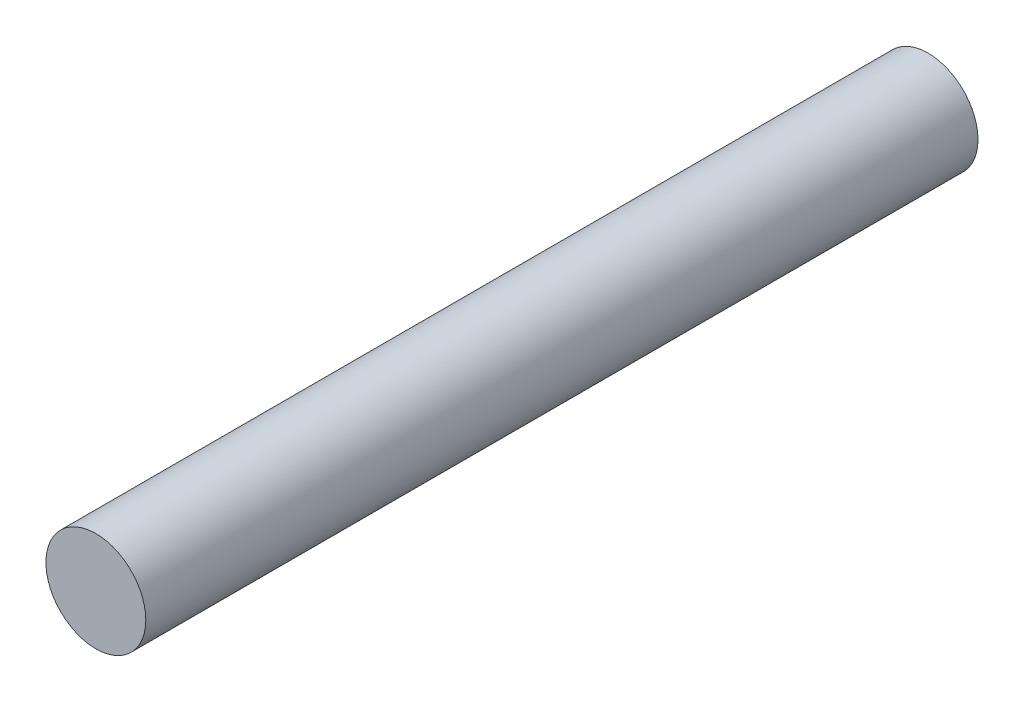
ISO-10303-21;
HEADER;
FILE_DESCRIPTION(('STEP AP214'),'2;1');
FILE_NAME('part.step','',(''),(''),'','','');
FILE_SCHEMA(('AUTOMOTIVE_DESIGN { 1 0 10303 214 1 1 1 1 }'));
ENDSEC;
DATA;
#1=APPLICATION_CONTEXT('core data for automotive mechanical design processes');
#2=APPLICATION_PROTOCOL_DEFINITION('international standard','automotive_design',2000,#1);
#3=PRODUCT_CONTEXT('',#1,'mechanical');
#4=PRODUCT('Part','Part','',(#3));
#5=PRODUCT_RELATED_PRODUCT_CATEGORY('part','',(#4));
#6=PRODUCT_DEFINITION_FORMATION('','',#4);
#7=PRODUCT_DEFINITION_CONTEXT('part definition',#1,'design');
#8=PRODUCT_DEFINITION('design','',#6,#7);
#9=PRODUCT_DEFINITION_SHAPE('','',#8);
#10=(LENGTH_UNIT() NAMED_UNIT(*) SI_UNIT(.MILLI.,.METRE.));
#11=(NAMED_UNIT(*) PLANE_ANGLE_UNIT() SI_UNIT($,.RADIAN.));
#12=(NAMED_UNIT(*) SI_UNIT($,.STERADIAN.) SOLID_ANGLE_UNIT());
#13=UNCERTAINTY_MEASURE_WITH_UNIT(LENGTH_MEASURE(1.E-05),#10,'distance_accuracy_value','');
#14=(GEOMETRIC_REPRESENTATION_CONTEXT(3) GLOBAL_UNCERTAINTY_ASSIGNED_CONTEXT((#13)) GLOBAL_UNIT_ASSIGNED_CONTEXT((#10,
#11,#12)) REPRESENTATION_CONTEXT('',''));
#15=CARTESIAN_POINT('',(0.,0.,0.));
#16=DIRECTION('',(0.,0.,1.));
#17=DIRECTION('',(1.,0.,0.));
#18=AXIS2_PLACEMENT_3D('',#15,#16,#17);
#19=CARTESIAN_POINT('',(0.,0.,25.));
#20=DIRECTION('',(0.,0.,-1.));
#21=DIRECTION('',(-1.,0.,0.));
#22=AXIS2_PLACEMENT_3D('',#19,#20,#21);
#23=CYLINDRICAL_SURFACE('',#22,1.5);
#24=CARTESIAN_POINT('',(0.,0.,25.));
#25=DIRECTION('',(0.,0.,1.));
#26=DIRECTION('',(1.,0.,0.));
#27=AXIS2_PLACEMENT_3D('',#24,#25,#26);
#28=CIRCLE('',#27,1.5);
#29=CARTESIAN_POINT('',(1.5,0.,25.));
#30=VERTEX_POINT('',#29);
#31=EDGE_CURVE('E10',#30,#30,#28,.T.);
#32=ORIENTED_EDGE('',*,*,#31,.F.);
#33=EDGE_LOOP('',(#32));
#34=FACE_BOUND('',#33,.T.);
#35=CARTESIAN_POINT('',(0.,0.,0.));
#36=DIRECTION('',(0.,0.,1.));
#37=DIRECTION('',(1.,0.,0.));
#38=AXIS2_PLACEMENT_3D('',#35,#36,#37);
#39=CIRCLE('',#38,1.5);
#40=CARTESIAN_POINT('',(1.5,0.,0.));
#41=VERTEX_POINT('',#40);
#42=EDGE_CURVE('E33',#41,#41,#39,.T.);
#43=ORIENTED_EDGE('',*,*,#42,.T.);
#44=EDGE_LOOP('',(#43));
#45=FACE_BOUND('',#44,.T.);
#46=ADVANCED_FACE('F27',(#34,#45),#23,.T.);
#47=CARTESIAN_POINT('',(0.,0.,25.));
#48=DIRECTION('',(0.,0.,1.));
#49=DIRECTION('',(1.,0.,0.));
#50=AXIS2_PLACEMENT_3D('',#47,#48,#49);
#51=PLANE('',#50);
#52=ORIENTED_EDGE('',*,*,#31,.T.);
#53=EDGE_LOOP('',(#52));
#54=FACE_BOUND('',#53,.T.);
#55=ADVANCED_FACE('F42',(#54),#51,.T.);
#56=CARTESIAN_POINT('',(0.,0.,0.));
#57=DIRECTION('',(0.,0.,1.));
#58=DIRECTION('',(1.,0.,0.));
#59=AXIS2_PLACEMENT_3D('',#56,#57,#58);
#60=PLANE('',#59);
#61=ORIENTED_EDGE('',*,*,#42,.F.);
#62=EDGE_LOOP('',(#61));
#63=FACE_BOUND('',#62,.T.);
#64=ADVANCED_FACE('F40',(#63),#60,.F.);
#65=CLOSED_SHELL('',(#46,#55,#64));
#66=MANIFOLD_SOLID_BREP('B2',#65);
#67=ADVANCED_BREP_SHAPE_REPRESENTATION('',(#18,#66),#14);
#68=SHAPE_DEFINITION_REPRESENTATION(#9,#67);
ENDSEC;
END-ISO-10303-21;
